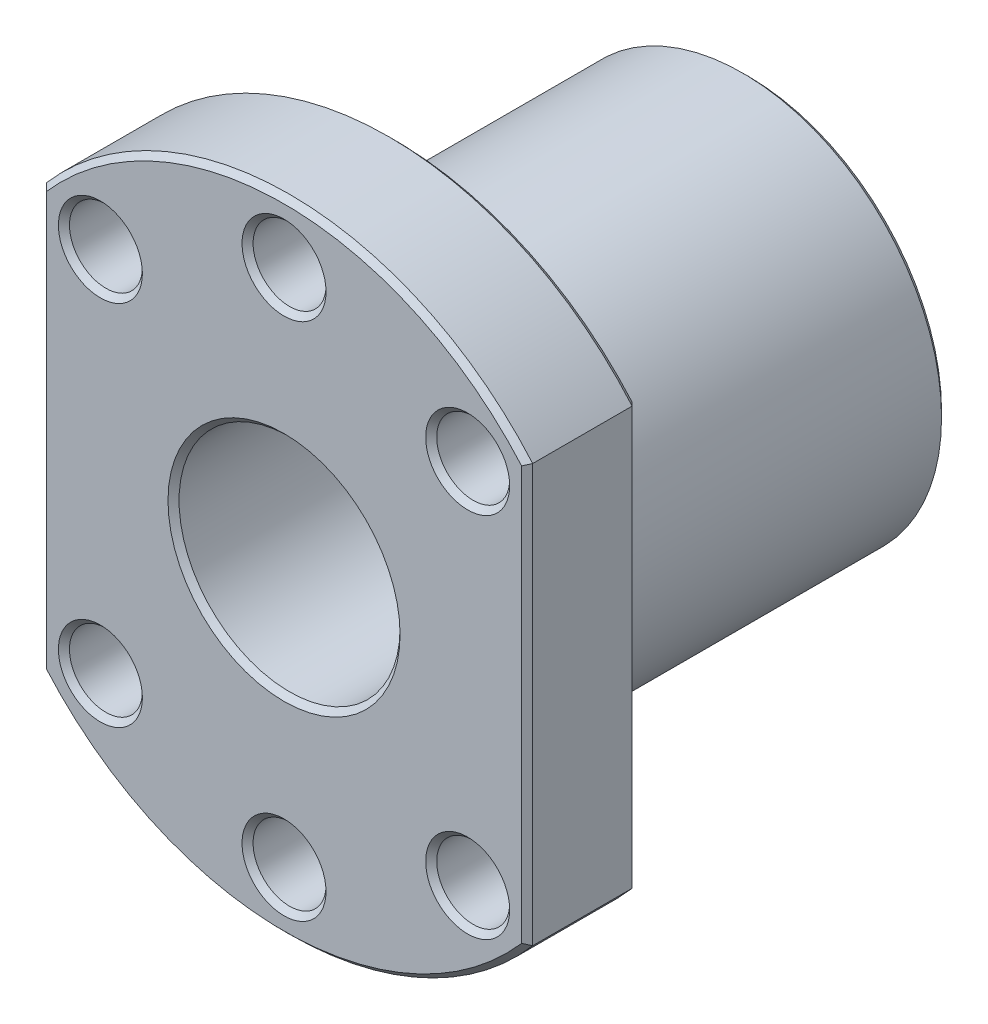
ISO-10303-21;
HEADER;
FILE_DESCRIPTION(('STEP AP214'),'2;1');
FILE_NAME('part.step','',(''),(''),'','','');
FILE_SCHEMA(('AUTOMOTIVE_DESIGN { 1 0 10303 214 1 1 1 1 }'));
ENDSEC;
DATA;
#1=APPLICATION_CONTEXT('core data for automotive mechanical design processes');
#2=APPLICATION_PROTOCOL_DEFINITION('international standard','automotive_design',2000,#1);
#3=PRODUCT_CONTEXT('',#1,'mechanical');
#4=PRODUCT('Part','Part','',(#3));
#5=PRODUCT_RELATED_PRODUCT_CATEGORY('part','',(#4));
#6=PRODUCT_DEFINITION_FORMATION('','',#4);
#7=PRODUCT_DEFINITION_CONTEXT('part definition',#1,'design');
#8=PRODUCT_DEFINITION('design','',#6,#7);
#9=PRODUCT_DEFINITION_SHAPE('','',#8);
#10=(LENGTH_UNIT() NAMED_UNIT(*) SI_UNIT(.MILLI.,.METRE.));
#11=(NAMED_UNIT(*) PLANE_ANGLE_UNIT() SI_UNIT($,.RADIAN.));
#12=(NAMED_UNIT(*) SI_UNIT($,.STERADIAN.) SOLID_ANGLE_UNIT());
#13=UNCERTAINTY_MEASURE_WITH_UNIT(LENGTH_MEASURE(1.E-05),#10,'distance_accuracy_value','');
#14=(GEOMETRIC_REPRESENTATION_CONTEXT(3) GLOBAL_UNCERTAINTY_ASSIGNED_CONTEXT((#13)) GLOBAL_UNIT_ASSIGNED_CONTEXT((#10,
#11,#12)) REPRESENTATION_CONTEXT('',''));
#15=CARTESIAN_POINT('',(0.,0.,0.));
#16=DIRECTION('',(0.,0.,1.));
#17=DIRECTION('',(1.,0.,0.));
#18=AXIS2_PLACEMENT_3D('',#15,#16,#17);
#19=CARTESIAN_POINT('',(0.,0.,0.));
#20=DIRECTION('',(0.,0.,1.00000000000001));
#21=DIRECTION('',(1.00000000000001,0.,0.));
#22=AXIS2_PLACEMENT_3D('',#19,#20,#21);
#23=PLANE('',#22);
#24=CARTESIAN_POINT('',(0.,0.,0.));
#25=DIRECTION('',(0.,0.,1.00000000000001));
#26=DIRECTION('',(1.00000000000001,0.,0.));
#27=AXIS2_PLACEMENT_3D('',#24,#25,#26);
#28=CIRCLE('',#27,18.5);
#29=CARTESIAN_POINT('',(18.5000000000002,0.,0.));
#30=VERTEX_POINT('',#29);
#31=EDGE_CURVE('E139',#30,#30,#28,.T.);
#32=ORIENTED_EDGE('',*,*,#31,.T.);
#33=EDGE_LOOP('',(#32));
#34=FACE_BOUND('',#33,.T.);
#35=CARTESIAN_POINT('',(0.,0.,0.));
#36=DIRECTION('',(0.,0.,1.00000000000001));
#37=DIRECTION('',(1.00000000000001,0.,0.));
#38=AXIS2_PLACEMENT_3D('',#35,#36,#37);
#39=CIRCLE('',#38,28.5);
#40=CARTESIAN_POINT('',(-21.5000000000002,18.7082869338698,0.));
#41=VERTEX_POINT('',#40);
#42=CARTESIAN_POINT('',(21.5,18.7082869338698,0.));
#43=VERTEX_POINT('',#42);
#44=EDGE_CURVE('E138',#41,#43,#39,.F.);
#45=ORIENTED_EDGE('',*,*,#44,.T.);
#46=DIRECTION('',(0.,-1.,0.));
#47=VECTOR('',#46,1.);
#48=CARTESIAN_POINT('',(21.5,0.,-4.40619762898109E-13));
#49=LINE('',#48,#47);
#50=CARTESIAN_POINT('',(21.5,-18.7082869338697,0.));
#51=VERTEX_POINT('',#50);
#52=EDGE_CURVE('E117',#43,#51,#49,.T.);
#53=ORIENTED_EDGE('',*,*,#52,.T.);
#54=CARTESIAN_POINT('',(0.,0.,0.));
#55=DIRECTION('',(0.,0.,1.00000000000001));
#56=DIRECTION('',(1.00000000000001,0.,0.));
#57=AXIS2_PLACEMENT_3D('',#54,#55,#56);
#58=CIRCLE('',#57,28.5);
#59=CARTESIAN_POINT('',(-21.5000000000004,-18.7082869338697,0.));
#60=VERTEX_POINT('',#59);
#61=EDGE_CURVE('E127',#51,#60,#58,.F.);
#62=ORIENTED_EDGE('',*,*,#61,.T.);
#63=DIRECTION('',(0.,1.,0.));
#64=VECTOR('',#63,1.);
#65=CARTESIAN_POINT('',(-21.5000000000002,0.,0.));
#66=LINE('',#65,#64);
#67=EDGE_CURVE('E133',#60,#41,#66,.T.);
#68=ORIENTED_EDGE('',*,*,#67,.T.);
#69=EDGE_LOOP('',(#45,#53,#62,#68));
#70=FACE_BOUND('',#69,.T.);
#71=CARTESIAN_POINT('',(0.,23.5000000000001,0.));
#72=DIRECTION('',(0.,0.,1.00000000000001));
#73=DIRECTION('',(1.00000000000001,0.,0.));
#74=AXIS2_PLACEMENT_3D('',#71,#72,#73);
#75=CIRCLE('',#74,3.8);
#76=CARTESIAN_POINT('',(3.80000000000003,23.5000000000001,0.));
#77=VERTEX_POINT('',#76);
#78=EDGE_CURVE('E134',#77,#77,#75,.T.);
#79=ORIENTED_EDGE('',*,*,#78,.T.);
#80=EDGE_LOOP('',(#79));
#81=FACE_BOUND('',#80,.T.);
#82=CARTESIAN_POINT('',(16.6170093578839,16.617009357884,0.));
#83=DIRECTION('',(0.,0.,1.00000000000001));
#84=DIRECTION('',(1.00000000000001,0.,0.));
#85=AXIS2_PLACEMENT_3D('',#82,#83,#84);
#86=CIRCLE('',#85,3.8);
#87=CARTESIAN_POINT('',(20.4170093578839,16.617009357884,0.));
#88=VERTEX_POINT('',#87);
#89=EDGE_CURVE('E351',#88,#88,#86,.T.);
#90=ORIENTED_EDGE('',*,*,#89,.T.);
#91=EDGE_LOOP('',(#90));
#92=FACE_BOUND('',#91,.T.);
#93=CARTESIAN_POINT('',(16.6170093578839,-16.6170093578839,0.));
#94=DIRECTION('',(0.,0.,1.00000000000001));
#95=DIRECTION('',(1.00000000000001,0.,0.));
#96=AXIS2_PLACEMENT_3D('',#93,#94,#95);
#97=CIRCLE('',#96,3.8);
#98=CARTESIAN_POINT('',(20.4170093578839,-16.6170093578839,0.));
#99=VERTEX_POINT('',#98);
#100=EDGE_CURVE('E348',#99,#99,#97,.T.);
#101=ORIENTED_EDGE('',*,*,#100,.T.);
#102=EDGE_LOOP('',(#101));
#103=FACE_BOUND('',#102,.T.);
#104=CARTESIAN_POINT('',(-1.11022302462516E-13,-23.5,0.));
#105=DIRECTION('',(0.,0.,1.00000000000001));
#106=DIRECTION('',(1.00000000000001,0.,0.));
#107=AXIS2_PLACEMENT_3D('',#104,#105,#106);
#108=CIRCLE('',#107,3.8);
#109=CARTESIAN_POINT('',(3.79999999999992,-23.5,0.));
#110=VERTEX_POINT('',#109);
#111=EDGE_CURVE('E345',#110,#110,#108,.T.);
#112=ORIENTED_EDGE('',*,*,#111,.T.);
#113=EDGE_LOOP('',(#112));
#114=FACE_BOUND('',#113,.T.);
#115=CARTESIAN_POINT('',(-16.6170093578843,-16.6170093578839,0.));
#116=DIRECTION('',(0.,0.,1.00000000000001));
#117=DIRECTION('',(1.00000000000001,0.,0.));
#118=AXIS2_PLACEMENT_3D('',#115,#116,#117);
#119=CIRCLE('',#118,3.80000000000002);
#120=CARTESIAN_POINT('',(-12.8170093578842,-16.6170093578839,0.));
#121=VERTEX_POINT('',#120);
#122=EDGE_CURVE('E342',#121,#121,#119,.T.);
#123=ORIENTED_EDGE('',*,*,#122,.T.);
#124=EDGE_LOOP('',(#123));
#125=FACE_BOUND('',#124,.T.);
#126=CARTESIAN_POINT('',(-16.6170093578841,16.617009357884,0.));
#127=DIRECTION('',(0.,0.,1.00000000000001));
#128=DIRECTION('',(1.00000000000001,0.,0.));
#129=AXIS2_PLACEMENT_3D('',#126,#127,#128);
#130=CIRCLE('',#129,3.8);
#131=CARTESIAN_POINT('',(-12.8170093578841,16.617009357884,0.));
#132=VERTEX_POINT('',#131);
#133=EDGE_CURVE('E339',#132,#132,#130,.T.);
#134=ORIENTED_EDGE('',*,*,#133,.T.);
#135=EDGE_LOOP('',(#134));
#136=FACE_BOUND('',#135,.T.);
#137=ADVANCED_FACE('F40',(#34,#70,#81,#92,#103,#114,#125,#136),#23,.F.);
#138=CARTESIAN_POINT('',(0.,0.,10.));
#139=DIRECTION('',(0.,0.,1.00000000000001));
#140=DIRECTION('',(1.00000000000001,0.,0.));
#141=AXIS2_PLACEMENT_3D('',#138,#139,#140);
#142=PLANE('',#141);
#143=CARTESIAN_POINT('',(-16.617009357884,16.617009357884,10.));
#144=DIRECTION('',(0.,0.,1.00000000000001));
#145=DIRECTION('',(1.00000000000001,0.,0.));
#146=AXIS2_PLACEMENT_3D('',#143,#144,#145);
#147=CIRCLE('',#146,3.80000000000001);
#148=CARTESIAN_POINT('',(-12.8170093578839,16.617009357884,10.));
#149=VERTEX_POINT('',#148);
#150=EDGE_CURVE('E12',#149,#149,#147,.F.);
#151=ORIENTED_EDGE('',*,*,#150,.T.);
#152=EDGE_LOOP('',(#151));
#153=FACE_BOUND('',#152,.T.);
#154=CARTESIAN_POINT('',(0.,-23.5,10.));
#155=DIRECTION('',(0.,0.,1.00000000000001));
#156=DIRECTION('',(1.00000000000001,0.,0.));
#157=AXIS2_PLACEMENT_3D('',#154,#155,#156);
#158=CIRCLE('',#157,3.80000000000001);
#159=CARTESIAN_POINT('',(3.80000000000005,-23.5,10.));
#160=VERTEX_POINT('',#159);
#161=EDGE_CURVE('E54',#160,#160,#158,.F.);
#162=ORIENTED_EDGE('',*,*,#161,.T.);
#163=EDGE_LOOP('',(#162));
#164=FACE_BOUND('',#163,.T.);
#165=CARTESIAN_POINT('',(16.617009357884,16.617009357884,10.));
#166=DIRECTION('',(0.,0.,1.00000000000001));
#167=DIRECTION('',(1.00000000000001,0.,0.));
#168=AXIS2_PLACEMENT_3D('',#165,#166,#167);
#169=CIRCLE('',#168,3.80000000000001);
#170=CARTESIAN_POINT('',(20.417009357884,16.617009357884,10.));
#171=VERTEX_POINT('',#170);
#172=EDGE_CURVE('E216',#171,#171,#169,.F.);
#173=ORIENTED_EDGE('',*,*,#172,.T.);
#174=EDGE_LOOP('',(#173));
#175=FACE_BOUND('',#174,.T.);
#176=CARTESIAN_POINT('',(0.,0.,10.));
#177=DIRECTION('',(0.,0.,1.00000000000001));
#178=DIRECTION('',(1.00000000000001,0.,0.));
#179=AXIS2_PLACEMENT_3D('',#176,#177,#178);
#180=CIRCLE('',#179,10.5);
#181=CARTESIAN_POINT('',(10.5000000000001,0.,10.));
#182=VERTEX_POINT('',#181);
#183=EDGE_CURVE('E213',#182,#182,#180,.F.);
#184=ORIENTED_EDGE('',*,*,#183,.T.);
#185=EDGE_LOOP('',(#184));
#186=FACE_BOUND('',#185,.T.);
#187=CARTESIAN_POINT('',(0.,0.,10.));
#188=DIRECTION('',(0.,0.,1.00000000000001));
#189=DIRECTION('',(1.00000000000001,0.,0.));
#190=AXIS2_PLACEMENT_3D('',#187,#188,#189);
#191=CIRCLE('',#190,28.5);
#192=CARTESIAN_POINT('',(21.5000000000001,18.7082869338698,10.));
#193=VERTEX_POINT('',#192);
#194=CARTESIAN_POINT('',(-21.5000000000001,18.7082869338699,10.));
#195=VERTEX_POINT('',#194);
#196=EDGE_CURVE('E62',#193,#195,#191,.T.);
#197=ORIENTED_EDGE('',*,*,#196,.T.);
#198=DIRECTION('',(0.,-1.,0.));
#199=VECTOR('',#198,1.);
#200=CARTESIAN_POINT('',(-21.5000000000002,-18.8944436276912,10.));
#201=LINE('',#200,#199);
#202=CARTESIAN_POINT('',(-21.5000000000002,-18.7082869338697,10.));
#203=VERTEX_POINT('',#202);
#204=EDGE_CURVE('E211',#195,#203,#201,.T.);
#205=ORIENTED_EDGE('',*,*,#204,.T.);
#206=CARTESIAN_POINT('',(0.,0.,10.));
#207=DIRECTION('',(0.,0.,1.00000000000001));
#208=DIRECTION('',(1.00000000000001,0.,0.));
#209=AXIS2_PLACEMENT_3D('',#206,#207,#208);
#210=CIRCLE('',#209,28.5);
#211=CARTESIAN_POINT('',(21.5,-18.7082869338697,10.));
#212=VERTEX_POINT('',#211);
#213=EDGE_CURVE('E207',#203,#212,#210,.T.);
#214=ORIENTED_EDGE('',*,*,#213,.T.);
#215=DIRECTION('',(0.,1.,0.));
#216=VECTOR('',#215,1.);
#217=CARTESIAN_POINT('',(21.5000000000001,18.8944436276913,10.));
#218=LINE('',#217,#216);
#219=EDGE_CURVE('E67',#212,#193,#218,.T.);
#220=ORIENTED_EDGE('',*,*,#219,.T.);
#221=EDGE_LOOP('',(#197,#205,#214,#220));
#222=FACE_BOUND('',#221,.T.);
#223=CARTESIAN_POINT('',(1.11022302462516E-13,23.5000000000001,10.));
#224=DIRECTION('',(0.,0.,1.00000000000001));
#225=DIRECTION('',(1.00000000000001,0.,0.));
#226=AXIS2_PLACEMENT_3D('',#223,#224,#225);
#227=CIRCLE('',#226,3.80000000000001);
#228=CARTESIAN_POINT('',(3.80000000000016,23.5000000000001,10.));
#229=VERTEX_POINT('',#228);
#230=EDGE_CURVE('E204',#229,#229,#227,.F.);
#231=ORIENTED_EDGE('',*,*,#230,.T.);
#232=EDGE_LOOP('',(#231));
#233=FACE_BOUND('',#232,.T.);
#234=CARTESIAN_POINT('',(16.6170093578839,-16.6170093578839,10.));
#235=DIRECTION('',(0.,0.,1.00000000000001));
#236=DIRECTION('',(1.00000000000001,0.,0.));
#237=AXIS2_PLACEMENT_3D('',#234,#235,#236);
#238=CIRCLE('',#237,3.80000000000001);
#239=CARTESIAN_POINT('',(20.4170093578839,-16.6170093578839,10.));
#240=VERTEX_POINT('',#239);
#241=EDGE_CURVE('E201',#240,#240,#238,.F.);
#242=ORIENTED_EDGE('',*,*,#241,.T.);
#243=EDGE_LOOP('',(#242));
#244=FACE_BOUND('',#243,.T.);
#245=CARTESIAN_POINT('',(-16.6170093578841,-16.6170093578839,10.));
#246=DIRECTION('',(0.,0.,1.00000000000001));
#247=DIRECTION('',(1.00000000000001,0.,0.));
#248=AXIS2_PLACEMENT_3D('',#245,#246,#247);
#249=CIRCLE('',#248,3.80000000000001);
#250=CARTESIAN_POINT('',(-12.8170093578841,-16.6170093578839,10.));
#251=VERTEX_POINT('',#250);
#252=EDGE_CURVE('E198',#251,#251,#249,.F.);
#253=ORIENTED_EDGE('',*,*,#252,.T.);
#254=EDGE_LOOP('',(#253));
#255=FACE_BOUND('',#254,.T.);
#256=ADVANCED_FACE('F365',(#153,#164,#175,#186,#222,#233,#244,#255),#142,.T.);
#257=CARTESIAN_POINT('',(0.,0.,10.));
#258=DIRECTION('',(0.,0.,-1.00000000000001));
#259=DIRECTION('',(-1.00000000000001,0.,0.));
#260=AXIS2_PLACEMENT_3D('',#257,#258,#259);
#261=CYLINDRICAL_SURFACE('',#260,29.);
#262=DIRECTION('',(0.,0.,-1.00000000000001));
#263=VECTOR('',#262,1.);
#264=CARTESIAN_POINT('',(-22.0000000000002,-18.8944436276912,10.));
#265=LINE('',#264,#263);
#266=CARTESIAN_POINT('',(-22.0000000000002,-18.8944436276912,9.50000000000007));
#267=VERTEX_POINT('',#266);
#268=CARTESIAN_POINT('',(-22.0000000000004,-18.8944436276912,0.500000000000056));
#269=VERTEX_POINT('',#268);
#270=EDGE_CURVE('E250',#267,#269,#265,.T.);
#271=ORIENTED_EDGE('',*,*,#270,.T.);
#272=CARTESIAN_POINT('',(0.,0.,0.500000000000056));
#273=DIRECTION('',(0.,0.,1.00000000000001));
#274=DIRECTION('',(1.00000000000001,0.,0.));
#275=AXIS2_PLACEMENT_3D('',#272,#273,#274);
#276=CIRCLE('',#275,29.);
#277=CARTESIAN_POINT('',(21.9999999999998,-18.8944436276912,0.500000000000056));
#278=VERTEX_POINT('',#277);
#279=EDGE_CURVE('E160',#269,#278,#276,.T.);
#280=ORIENTED_EDGE('',*,*,#279,.T.);
#281=DIRECTION('',(0.,0.,-1.00000000000001));
#282=VECTOR('',#281,1.);
#283=CARTESIAN_POINT('',(22.,-18.8944436276912,10.));
#284=LINE('',#283,#282);
#285=CARTESIAN_POINT('',(22.,-18.8944436276912,9.50000000000007));
#286=VERTEX_POINT('',#285);
#287=EDGE_CURVE('E315',#286,#278,#284,.T.);
#288=ORIENTED_EDGE('',*,*,#287,.F.);
#289=CARTESIAN_POINT('',(0.,0.,9.50000000000007));
#290=DIRECTION('',(0.,0.,1.00000000000001));
#291=DIRECTION('',(1.00000000000001,0.,0.));
#292=AXIS2_PLACEMENT_3D('',#289,#290,#291);
#293=CIRCLE('',#292,29.);
#294=EDGE_CURVE('E158',#286,#267,#293,.F.);
#295=ORIENTED_EDGE('',*,*,#294,.T.);
#296=EDGE_LOOP('',(#271,#280,#288,#295));
#297=FACE_BOUND('',#296,.T.);
#298=ADVANCED_FACE('F364',(#297),#261,.T.);
#299=CARTESIAN_POINT('',(22.0000000000001,18.8944436276913,10.));
#300=DIRECTION('',(-1.00000000000001,0.,0.));
#301=DIRECTION('',(0.,0.,1.00000000000001));
#302=AXIS2_PLACEMENT_3D('',#299,#300,#301);
#303=PLANE('',#302);
#304=ORIENTED_EDGE('',*,*,#287,.T.);
#305=DIRECTION('',(0.,1.,0.));
#306=VECTOR('',#305,1.);
#307=CARTESIAN_POINT('',(22.,18.8944436276913,0.499999999999945));
#308=LINE('',#307,#306);
#309=CARTESIAN_POINT('',(22.,18.8944436276913,0.499999999999945));
#310=VERTEX_POINT('',#309);
#311=EDGE_CURVE('E120',#278,#310,#308,.T.);
#312=ORIENTED_EDGE('',*,*,#311,.T.);
#313=DIRECTION('',(0.,0.,-1.00000000000001));
#314=VECTOR('',#313,1.);
#315=CARTESIAN_POINT('',(22.0000000000001,18.8944436276913,10.));
#316=LINE('',#315,#314);
#317=CARTESIAN_POINT('',(22.0000000000001,18.8944436276913,9.49999999999996));
#318=VERTEX_POINT('',#317);
#319=EDGE_CURVE('E313',#318,#310,#316,.T.);
#320=ORIENTED_EDGE('',*,*,#319,.F.);
#321=DIRECTION('',(0.,-1.,0.));
#322=VECTOR('',#321,1.);
#323=CARTESIAN_POINT('',(22.,-18.8944436276912,9.50000000000007));
#324=LINE('',#323,#322);
#325=EDGE_CURVE('E142',#318,#286,#324,.T.);
#326=ORIENTED_EDGE('',*,*,#325,.T.);
#327=EDGE_LOOP('',(#304,#312,#320,#326));
#328=FACE_BOUND('',#327,.T.);
#329=ADVANCED_FACE('F360',(#328),#303,.F.);
#330=CARTESIAN_POINT('',(0.,0.,10.));
#331=DIRECTION('',(0.,0.,-1.00000000000001));
#332=DIRECTION('',(-1.00000000000001,0.,0.));
#333=AXIS2_PLACEMENT_3D('',#330,#331,#332);
#334=CYLINDRICAL_SURFACE('',#333,29.);
#335=ORIENTED_EDGE('',*,*,#319,.T.);
#336=CARTESIAN_POINT('',(0.,0.,0.500000000000056));
#337=DIRECTION('',(0.,0.,1.00000000000001));
#338=DIRECTION('',(1.00000000000001,0.,0.));
#339=AXIS2_PLACEMENT_3D('',#336,#337,#338);
#340=CIRCLE('',#339,29.);
#341=CARTESIAN_POINT('',(-22.0000000000003,18.8944436276914,0.499999999999948));
#342=VERTEX_POINT('',#341);
#343=EDGE_CURVE('E151',#310,#342,#340,.T.);
#344=ORIENTED_EDGE('',*,*,#343,.T.);
#345=DIRECTION('',(0.,0.,-1.00000000000001));
#346=VECTOR('',#345,1.);
#347=CARTESIAN_POINT('',(-22.0000000000001,18.8944436276913,10.));
#348=LINE('',#347,#346);
#349=CARTESIAN_POINT('',(-22.0000000000001,18.8944436276913,9.49999999999996));
#350=VERTEX_POINT('',#349);
#351=EDGE_CURVE('E308',#350,#342,#348,.T.);
#352=ORIENTED_EDGE('',*,*,#351,.F.);
#353=CARTESIAN_POINT('',(0.,0.,9.50000000000007));
#354=DIRECTION('',(0.,0.,1.00000000000001));
#355=DIRECTION('',(1.00000000000001,0.,0.));
#356=AXIS2_PLACEMENT_3D('',#353,#354,#355);
#357=CIRCLE('',#356,29.);
#358=EDGE_CURVE('E149',#350,#318,#357,.F.);
#359=ORIENTED_EDGE('',*,*,#358,.T.);
#360=EDGE_LOOP('',(#335,#344,#352,#359));
#361=FACE_BOUND('',#360,.T.);
#362=ADVANCED_FACE('F311',(#361),#334,.T.);
#363=CARTESIAN_POINT('',(-22.0000000000001,18.8944436276913,10.));
#364=DIRECTION('',(1.00000000000001,0.,0.));
#365=DIRECTION('',(0.,0.,-1.00000000000001));
#366=AXIS2_PLACEMENT_3D('',#363,#364,#365);
#367=PLANE('',#366);
#368=ORIENTED_EDGE('',*,*,#351,.T.);
#369=DIRECTION('',(0.,-1.,0.));
#370=VECTOR('',#369,1.);
#371=CARTESIAN_POINT('',(-22.0000000000003,18.8944436276914,0.499999999999948));
#372=LINE('',#371,#370);
#373=EDGE_CURVE('E156',#342,#269,#372,.T.);
#374=ORIENTED_EDGE('',*,*,#373,.T.);
#375=ORIENTED_EDGE('',*,*,#270,.F.);
#376=DIRECTION('',(0.,1.,0.));
#377=VECTOR('',#376,1.);
#378=CARTESIAN_POINT('',(-22.0000000000001,18.8944436276913,9.49999999999996));
#379=LINE('',#378,#377);
#380=EDGE_CURVE('E153',#267,#350,#379,.T.);
#381=ORIENTED_EDGE('',*,*,#380,.T.);
#382=EDGE_LOOP('',(#368,#374,#375,#381));
#383=FACE_BOUND('',#382,.T.);
#384=ADVANCED_FACE('F307',(#383),#367,.F.);
#385=CARTESIAN_POINT('',(0.,0.,10.));
#386=DIRECTION('',(0.,0.,-1.00000000000001));
#387=DIRECTION('',(-1.00000000000001,0.,0.));
#388=AXIS2_PLACEMENT_3D('',#385,#386,#387);
#389=CYLINDRICAL_SURFACE('',#388,10.);
#390=CARTESIAN_POINT('',(2.22044604925031E-13,0.,-31.5));
#391=DIRECTION('',(0.,0.,1.00000000000001));
#392=DIRECTION('',(1.00000000000001,0.,0.));
#393=AXIS2_PLACEMENT_3D('',#390,#391,#392);
#394=CIRCLE('',#393,10.);
#395=CARTESIAN_POINT('',(10.0000000000003,0.,-31.5));
#396=VERTEX_POINT('',#395);
#397=EDGE_CURVE('E336',#396,#396,#394,.F.);
#398=ORIENTED_EDGE('',*,*,#397,.T.);
#399=EDGE_LOOP('',(#398));
#400=FACE_BOUND('',#399,.T.);
#401=CARTESIAN_POINT('',(0.,0.,9.50000000000007));
#402=DIRECTION('',(0.,0.,1.00000000000001));
#403=DIRECTION('',(1.00000000000001,0.,0.));
#404=AXIS2_PLACEMENT_3D('',#401,#402,#403);
#405=CIRCLE('',#404,10.);
#406=CARTESIAN_POINT('',(10.0000000000001,0.,9.50000000000007));
#407=VERTEX_POINT('',#406);
#408=EDGE_CURVE('E333',#407,#407,#405,.T.);
#409=ORIENTED_EDGE('',*,*,#408,.T.);
#410=EDGE_LOOP('',(#409));
#411=FACE_BOUND('',#410,.T.);
#412=ADVANCED_FACE('F406',(#400,#411),#389,.F.);
#413=CARTESIAN_POINT('',(1.11022302462516E-13,23.5000000000001,10.));
#414=DIRECTION('',(0.,0.,-1.00000000000001));
#415=DIRECTION('',(-1.00000000000001,0.,0.));
#416=AXIS2_PLACEMENT_3D('',#413,#414,#415);
#417=CYLINDRICAL_SURFACE('',#416,3.3);
#418=CARTESIAN_POINT('',(0.,23.5000000000001,0.500000000000056));
#419=DIRECTION('',(0.,0.,1.00000000000001));
#420=DIRECTION('',(1.00000000000001,0.,0.));
#421=AXIS2_PLACEMENT_3D('',#418,#419,#420);
#422=CIRCLE('',#421,3.3);
#423=CARTESIAN_POINT('',(3.30000000000003,23.5000000000001,0.500000000000055));
#424=VERTEX_POINT('',#423);
#425=EDGE_CURVE('E165',#424,#424,#422,.F.);
#426=ORIENTED_EDGE('',*,*,#425,.T.);
#427=EDGE_LOOP('',(#426));
#428=FACE_BOUND('',#427,.T.);
#429=CARTESIAN_POINT('',(1.11022302462516E-13,23.5000000000001,9.50000000000007));
#430=DIRECTION('',(0.,0.,1.00000000000001));
#431=DIRECTION('',(1.00000000000001,0.,0.));
#432=AXIS2_PLACEMENT_3D('',#429,#430,#431);
#433=CIRCLE('',#432,3.3);
#434=CARTESIAN_POINT('',(3.30000000000014,23.5000000000001,9.50000000000007));
#435=VERTEX_POINT('',#434);
#436=EDGE_CURVE('E162',#435,#435,#433,.T.);
#437=ORIENTED_EDGE('',*,*,#436,.T.);
#438=EDGE_LOOP('',(#437));
#439=FACE_BOUND('',#438,.T.);
#440=ADVANCED_FACE('F595',(#428,#439),#417,.F.);
#441=CARTESIAN_POINT('',(16.617009357884,16.617009357884,10.));
#442=DIRECTION('',(0.,0.,-1.00000000000001));
#443=DIRECTION('',(-1.00000000000001,0.,0.));
#444=AXIS2_PLACEMENT_3D('',#441,#442,#443);
#445=CYLINDRICAL_SURFACE('',#444,3.3);
#446=CARTESIAN_POINT('',(16.6170093578839,16.617009357884,0.500000000000056));
#447=DIRECTION('',(0.,0.,1.00000000000001));
#448=DIRECTION('',(1.00000000000001,0.,0.));
#449=AXIS2_PLACEMENT_3D('',#446,#447,#448);
#450=CIRCLE('',#449,3.3);
#451=CARTESIAN_POINT('',(19.9170093578839,16.617009357884,0.500000000000055));
#452=VERTEX_POINT('',#451);
#453=EDGE_CURVE('E171',#452,#452,#450,.F.);
#454=ORIENTED_EDGE('',*,*,#453,.T.);
#455=EDGE_LOOP('',(#454));
#456=FACE_BOUND('',#455,.T.);
#457=CARTESIAN_POINT('',(16.617009357884,16.617009357884,9.50000000000007));
#458=DIRECTION('',(0.,0.,1.00000000000001));
#459=DIRECTION('',(1.00000000000001,0.,0.));
#460=AXIS2_PLACEMENT_3D('',#457,#458,#459);
#461=CIRCLE('',#460,3.3);
#462=CARTESIAN_POINT('',(19.917009357884,16.617009357884,9.50000000000007));
#463=VERTEX_POINT('',#462);
#464=EDGE_CURVE('E168',#463,#463,#461,.T.);
#465=ORIENTED_EDGE('',*,*,#464,.T.);
#466=EDGE_LOOP('',(#465));
#467=FACE_BOUND('',#466,.T.);
#468=ADVANCED_FACE('F589',(#456,#467),#445,.F.);
#469=CARTESIAN_POINT('',(16.6170093578839,-16.6170093578839,10.));
#470=DIRECTION('',(0.,0.,-1.00000000000001));
#471=DIRECTION('',(-1.00000000000001,0.,0.));
#472=AXIS2_PLACEMENT_3D('',#469,#470,#471);
#473=CYLINDRICAL_SURFACE('',#472,3.3);
#474=CARTESIAN_POINT('',(16.6170093578837,-16.6170093578839,0.499999999999948));
#475=DIRECTION('',(0.,0.,1.00000000000001));
#476=DIRECTION('',(1.00000000000001,0.,0.));
#477=AXIS2_PLACEMENT_3D('',#474,#475,#476);
#478=CIRCLE('',#477,3.3);
#479=CARTESIAN_POINT('',(19.9170093578837,-16.6170093578839,0.499999999999948));
#480=VERTEX_POINT('',#479);
#481=EDGE_CURVE('E177',#480,#480,#478,.F.);
#482=ORIENTED_EDGE('',*,*,#481,.T.);
#483=EDGE_LOOP('',(#482));
#484=FACE_BOUND('',#483,.T.);
#485=CARTESIAN_POINT('',(16.6170093578839,-16.6170093578839,9.49999999999996));
#486=DIRECTION('',(0.,0.,1.00000000000001));
#487=DIRECTION('',(1.00000000000001,0.,0.));
#488=AXIS2_PLACEMENT_3D('',#485,#486,#487);
#489=CIRCLE('',#488,3.3);
#490=CARTESIAN_POINT('',(19.9170093578839,-16.6170093578839,9.49999999999996));
#491=VERTEX_POINT('',#490);
#492=EDGE_CURVE('E174',#491,#491,#489,.T.);
#493=ORIENTED_EDGE('',*,*,#492,.T.);
#494=EDGE_LOOP('',(#493));
#495=FACE_BOUND('',#494,.T.);
#496=ADVANCED_FACE('F394',(#484,#495),#473,.F.);
#497=CARTESIAN_POINT('',(0.,-23.5,10.));
#498=DIRECTION('',(0.,0.,-1.00000000000001));
#499=DIRECTION('',(-1.00000000000001,0.,0.));
#500=AXIS2_PLACEMENT_3D('',#497,#498,#499);
#501=CYLINDRICAL_SURFACE('',#500,3.3);
#502=CARTESIAN_POINT('',(-1.11022302462516E-13,-23.5,0.499999999999945));
#503=DIRECTION('',(0.,0.,1.00000000000001));
#504=DIRECTION('',(1.00000000000001,0.,0.));
#505=AXIS2_PLACEMENT_3D('',#502,#503,#504);
#506=CIRCLE('',#505,3.3);
#507=CARTESIAN_POINT('',(3.29999999999992,-23.5,0.499999999999944));
#508=VERTEX_POINT('',#507);
#509=EDGE_CURVE('E183',#508,#508,#506,.F.);
#510=ORIENTED_EDGE('',*,*,#509,.T.);
#511=EDGE_LOOP('',(#510));
#512=FACE_BOUND('',#511,.T.);
#513=CARTESIAN_POINT('',(0.,-23.5,9.49999999999996));
#514=DIRECTION('',(0.,0.,1.00000000000001));
#515=DIRECTION('',(1.00000000000001,0.,0.));
#516=AXIS2_PLACEMENT_3D('',#513,#514,#515);
#517=CIRCLE('',#516,3.3);
#518=CARTESIAN_POINT('',(3.30000000000003,-23.5,9.49999999999996));
#519=VERTEX_POINT('',#518);
#520=EDGE_CURVE('E180',#519,#519,#517,.T.);
#521=ORIENTED_EDGE('',*,*,#520,.T.);
#522=EDGE_LOOP('',(#521));
#523=FACE_BOUND('',#522,.T.);
#524=ADVANCED_FACE('F384',(#512,#523),#501,.F.);
#525=CARTESIAN_POINT('',(-16.6170093578841,-16.6170093578839,10.));
#526=DIRECTION('',(0.,0.,-1.00000000000001));
#527=DIRECTION('',(-1.00000000000001,0.,0.));
#528=AXIS2_PLACEMENT_3D('',#525,#526,#527);
#529=CYLINDRICAL_SURFACE('',#528,3.3);
#530=CARTESIAN_POINT('',(-16.6170093578843,-16.6170093578839,0.499999999999945));
#531=DIRECTION('',(0.,0.,1.00000000000001));
#532=DIRECTION('',(1.00000000000001,0.,0.));
#533=AXIS2_PLACEMENT_3D('',#530,#531,#532);
#534=CIRCLE('',#533,3.3);
#535=CARTESIAN_POINT('',(-13.3170093578843,-16.6170093578839,0.499999999999944));
#536=VERTEX_POINT('',#535);
#537=EDGE_CURVE('E189',#536,#536,#534,.F.);
#538=ORIENTED_EDGE('',*,*,#537,.T.);
#539=EDGE_LOOP('',(#538));
#540=FACE_BOUND('',#539,.T.);
#541=CARTESIAN_POINT('',(-16.6170093578841,-16.6170093578839,9.49999999999996));
#542=DIRECTION('',(0.,0.,1.00000000000001));
#543=DIRECTION('',(1.00000000000001,0.,0.));
#544=AXIS2_PLACEMENT_3D('',#541,#542,#543);
#545=CIRCLE('',#544,3.3);
#546=CARTESIAN_POINT('',(-13.3170093578841,-16.6170093578839,9.49999999999996));
#547=VERTEX_POINT('',#546);
#548=EDGE_CURVE('E186',#547,#547,#545,.T.);
#549=ORIENTED_EDGE('',*,*,#548,.T.);
#550=EDGE_LOOP('',(#549));
#551=FACE_BOUND('',#550,.T.);
#552=ADVANCED_FACE('F381',(#540,#551),#529,.F.);
#553=CARTESIAN_POINT('',(-16.617009357884,16.617009357884,10.));
#554=DIRECTION('',(0.,0.,-1.00000000000001));
#555=DIRECTION('',(-1.00000000000001,0.,0.));
#556=AXIS2_PLACEMENT_3D('',#553,#554,#555);
#557=CYLINDRICAL_SURFACE('',#556,3.3);
#558=CARTESIAN_POINT('',(-16.6170093578842,16.617009357884,0.500000000000056));
#559=DIRECTION('',(0.,0.,1.00000000000001));
#560=DIRECTION('',(1.00000000000001,0.,0.));
#561=AXIS2_PLACEMENT_3D('',#558,#559,#560);
#562=CIRCLE('',#561,3.3);
#563=CARTESIAN_POINT('',(-13.3170093578842,16.617009357884,0.500000000000055));
#564=VERTEX_POINT('',#563);
#565=EDGE_CURVE('E195',#564,#564,#562,.F.);
#566=ORIENTED_EDGE('',*,*,#565,.T.);
#567=EDGE_LOOP('',(#566));
#568=FACE_BOUND('',#567,.T.);
#569=CARTESIAN_POINT('',(-16.617009357884,16.617009357884,9.50000000000007));
#570=DIRECTION('',(0.,0.,1.00000000000001));
#571=DIRECTION('',(1.00000000000001,0.,0.));
#572=AXIS2_PLACEMENT_3D('',#569,#570,#571);
#573=CIRCLE('',#572,3.3);
#574=CARTESIAN_POINT('',(-13.317009357884,16.617009357884,9.50000000000007));
#575=VERTEX_POINT('',#574);
#576=EDGE_CURVE('E192',#575,#575,#573,.T.);
#577=ORIENTED_EDGE('',*,*,#576,.T.);
#578=EDGE_LOOP('',(#577));
#579=FACE_BOUND('',#578,.T.);
#580=ADVANCED_FACE('F383',(#568,#579),#557,.F.);
#581=CARTESIAN_POINT('',(0.,0.,-124.911688245432));
#582=DIRECTION('',(0.,0.,1.00000000000001));
#583=DIRECTION('',(1.00000000000001,0.,0.));
#584=AXIS2_PLACEMENT_3D('',#581,#582,#583);
#585=CYLINDRICAL_SURFACE('',#584,18.);
#586=CARTESIAN_POINT('',(2.22044604925031E-13,0.,-31.5));
#587=DIRECTION('',(0.,0.,1.00000000000001));
#588=DIRECTION('',(1.00000000000001,0.,0.));
#589=AXIS2_PLACEMENT_3D('',#586,#587,#588);
#590=CIRCLE('',#589,18.);
#591=CARTESIAN_POINT('',(18.0000000000004,0.,-31.5));
#592=VERTEX_POINT('',#591);
#593=EDGE_CURVE('E324',#592,#592,#590,.T.);
#594=ORIENTED_EDGE('',*,*,#593,.T.);
#595=EDGE_LOOP('',(#594));
#596=FACE_BOUND('',#595,.T.);
#597=CARTESIAN_POINT('',(0.,0.,-0.500000000000056));
#598=DIRECTION('',(0.,0.,1.00000000000001));
#599=DIRECTION('',(1.00000000000001,0.,0.));
#600=AXIS2_PLACEMENT_3D('',#597,#598,#599);
#601=CIRCLE('',#600,18.);
#602=CARTESIAN_POINT('',(18.0000000000002,0.,-0.500000000000061));
#603=VERTEX_POINT('',#602);
#604=EDGE_CURVE('E321',#603,#603,#601,.F.);
#605=ORIENTED_EDGE('',*,*,#604,.T.);
#606=EDGE_LOOP('',(#605));
#607=FACE_BOUND('',#606,.T.);
#608=ADVANCED_FACE('F391',(#596,#607),#585,.T.);
#609=CARTESIAN_POINT('',(1.11022302462516E-13,0.,-32.));
#610=DIRECTION('',(0.,0.,1.00000000000001));
#611=DIRECTION('',(1.00000000000001,0.,0.));
#612=AXIS2_PLACEMENT_3D('',#609,#610,#611);
#613=PLANE('',#612);
#614=CARTESIAN_POINT('',(1.11022302462516E-13,0.,-32.));
#615=DIRECTION('',(0.,0.,1.00000000000001));
#616=DIRECTION('',(1.00000000000001,0.,0.));
#617=AXIS2_PLACEMENT_3D('',#614,#615,#616);
#618=CIRCLE('',#617,17.5);
#619=CARTESIAN_POINT('',(17.5000000000003,0.,-32.));
#620=VERTEX_POINT('',#619);
#621=EDGE_CURVE('E330',#620,#620,#618,.F.);
#622=ORIENTED_EDGE('',*,*,#621,.T.);
#623=EDGE_LOOP('',(#622));
#624=FACE_BOUND('',#623,.T.);
#625=CARTESIAN_POINT('',(1.11022302462516E-13,0.,-32.));
#626=DIRECTION('',(0.,0.,1.00000000000001));
#627=DIRECTION('',(1.00000000000001,0.,0.));
#628=AXIS2_PLACEMENT_3D('',#625,#626,#627);
#629=CIRCLE('',#628,10.5);
#630=CARTESIAN_POINT('',(10.5000000000002,0.,-32.));
#631=VERTEX_POINT('',#630);
#632=EDGE_CURVE('E327',#631,#631,#629,.T.);
#633=ORIENTED_EDGE('',*,*,#632,.T.);
#634=EDGE_LOOP('',(#633));
#635=FACE_BOUND('',#634,.T.);
#636=ADVANCED_FACE('F417',(#624,#635),#613,.F.);
#637=CARTESIAN_POINT('',(2.22044604925031E-13,0.,-31.5));
#638=DIRECTION('',(0.,0.,1.00000000000001));
#639=DIRECTION('',(1.00000000000001,0.,0.));
#640=AXIS2_PLACEMENT_3D('',#637,#638,#639);
#641=CONICAL_SURFACE('',#640,18.,0.785398163397441);
#642=ORIENTED_EDGE('',*,*,#621,.F.);
#643=EDGE_LOOP('',(#642));
#644=FACE_BOUND('',#643,.T.);
#645=ORIENTED_EDGE('',*,*,#593,.F.);
#646=EDGE_LOOP('',(#645));
#647=FACE_BOUND('',#646,.T.);
#648=ADVANCED_FACE('F413',(#644,#647),#641,.T.);
#649=CARTESIAN_POINT('',(1.11022302462516E-13,0.,-32.));
#650=DIRECTION('',(0.,0.,-1.00000000000001));
#651=DIRECTION('',(-1.00000000000001,0.,0.));
#652=AXIS2_PLACEMENT_3D('',#649,#650,#651);
#653=CONICAL_SURFACE('',#652,10.5,0.78539816339745);
#654=ORIENTED_EDGE('',*,*,#397,.F.);
#655=EDGE_LOOP('',(#654));
#656=FACE_BOUND('',#655,.T.);
#657=ORIENTED_EDGE('',*,*,#632,.F.);
#658=EDGE_LOOP('',(#657));
#659=FACE_BOUND('',#658,.T.);
#660=ADVANCED_FACE('F416',(#656,#659),#653,.F.);
#661=CARTESIAN_POINT('',(0.,0.,-0.500000000000056));
#662=DIRECTION('',(0.,0.,1.00000000000001));
#663=DIRECTION('',(1.00000000000001,0.,0.));
#664=AXIS2_PLACEMENT_3D('',#661,#662,#663);
#665=CONICAL_SURFACE('',#664,18.,0.785398163397441);
#666=ORIENTED_EDGE('',*,*,#31,.F.);
#667=EDGE_LOOP('',(#666));
#668=FACE_BOUND('',#667,.T.);
#669=ORIENTED_EDGE('',*,*,#604,.F.);
#670=EDGE_LOOP('',(#669));
#671=FACE_BOUND('',#670,.T.);
#672=ADVANCED_FACE('F420',(#668,#671),#665,.T.);
#673=CARTESIAN_POINT('',(-22.0000000000003,18.8944436276914,0.499999999999948));
#674=DIRECTION('',(0.707106781186547,0.,0.707106781186556));
#675=DIRECTION('',(0.,-1.,0.));
#676=AXIS2_PLACEMENT_3D('',#673,#674,#675);
#677=PLANE('',#676);
#678=CARTESIAN_POINT('',(-22.0000000000003,18.8944436276914,0.499999999999948));
#679=CARTESIAN_POINT('',(-21.9166399269159,18.8635611546942,0.416639926915473));
#680=CARTESIAN_POINT('',(-21.8332932238415,18.8326068604275,0.333293223841094));
#681=CARTESIAN_POINT('',(-21.6666265571746,18.7705546291546,0.166626557174273));
#682=CARTESIAN_POINT('',(-21.5833065935823,18.7394566921474,0.0833065935820033));
#683=CARTESIAN_POINT('',(-21.5000000000002,18.7082869338698,0.));
#684=B_SPLINE_CURVE_WITH_KNOTS('',3,(#678,#679,#680,#681,#682,#683),.UNSPECIFIED.,.F.,.F.,(4,2,
4),(0.,0.365600365758273,0.731200733878002),.UNSPECIFIED.);
#685=EDGE_CURVE('E123',#41,#342,#684,.F.);
#686=ORIENTED_EDGE('',*,*,#685,.F.);
#687=ORIENTED_EDGE('',*,*,#67,.F.);
#688=CARTESIAN_POINT('',(-22.0000000000004,-18.8944436276912,0.500000000000056));
#689=CARTESIAN_POINT('',(-21.9166399269159,-18.8635611546942,0.416639926915575));
#690=CARTESIAN_POINT('',(-21.8332932238415,-18.8326068604275,0.333293223841185));
#691=CARTESIAN_POINT('',(-21.6666265571747,-18.7705546291546,0.166626557174327));
#692=CARTESIAN_POINT('',(-21.5833065935824,-18.7394566921474,0.0833065935820315));
#693=CARTESIAN_POINT('',(-21.5000000000004,-18.7082869338697,0.));
#694=B_SPLINE_CURVE_WITH_KNOTS('',3,(#688,#689,#690,#691,#692,#693),.UNSPECIFIED.,.F.,.F.,(4,2,
4),(0.,0.365600365758277,0.731200733878007),.UNSPECIFIED.);
#695=EDGE_CURVE('E130',#269,#60,#694,.T.);
#696=ORIENTED_EDGE('',*,*,#695,.F.);
#697=ORIENTED_EDGE('',*,*,#373,.F.);
#698=EDGE_LOOP('',(#686,#687,#696,#697));
#699=FACE_BOUND('',#698,.T.);
#700=ADVANCED_FACE('F241',(#699),#677,.F.);
#701=CARTESIAN_POINT('',(0.,0.,0.500000000000056));
#702=DIRECTION('',(0.,0.,1.00000000000001));
#703=DIRECTION('',(1.00000000000001,0.,0.));
#704=AXIS2_PLACEMENT_3D('',#701,#702,#703);
#705=CONICAL_SURFACE('',#704,29.,0.785398163397455);
#706=ORIENTED_EDGE('',*,*,#695,.T.);
#707=ORIENTED_EDGE('',*,*,#61,.F.);
#708=CARTESIAN_POINT('',(21.5,-18.7082869338697,0.));
#709=CARTESIAN_POINT('',(21.583306593582,-18.7394566921476,0.0833065935819226));
#710=CARTESIAN_POINT('',(21.6666265571742,-18.7705546291549,0.166626557174163));
#711=CARTESIAN_POINT('',(21.833293223841,-18.8326068604278,0.333293223841021));
#712=CARTESIAN_POINT('',(21.9166399269154,-18.8635611546944,0.416639926915466));
#713=CARTESIAN_POINT('',(21.9999999999998,-18.8944436276912,0.500000000000056));
#714=B_SPLINE_CURVE_WITH_KNOTS('',3,(#708,#709,#710,#711,#712,#713),.UNSPECIFIED.,.F.,.F.,(4,2,
4),(0.,0.365600368119685,0.731200733877912),.UNSPECIFIED.);
#715=EDGE_CURVE('E113',#278,#51,#714,.F.);
#716=ORIENTED_EDGE('',*,*,#715,.F.);
#717=ORIENTED_EDGE('',*,*,#279,.F.);
#718=EDGE_LOOP('',(#706,#707,#716,#717));
#719=FACE_BOUND('',#718,.T.);
#720=ADVANCED_FACE('F128',(#719),#705,.T.);
#721=CARTESIAN_POINT('',(0.,0.,0.500000000000056));
#722=DIRECTION('',(0.,0.,1.00000000000001));
#723=DIRECTION('',(1.00000000000001,0.,0.));
#724=AXIS2_PLACEMENT_3D('',#721,#722,#723);
#725=CONICAL_SURFACE('',#724,29.,0.785398163397455);
#726=ORIENTED_EDGE('',*,*,#685,.T.);
#727=ORIENTED_EDGE('',*,*,#343,.F.);
#728=CARTESIAN_POINT('',(22.,18.8944436276913,0.499999999999945));
#729=CARTESIAN_POINT('',(21.9166399269155,18.8635611546944,0.416639926915436));
#730=CARTESIAN_POINT('',(21.8332932238411,18.8326068604278,0.333293223841041));
#731=CARTESIAN_POINT('',(21.6666265571743,18.770554629155,0.16662655717422));
#732=CARTESIAN_POINT('',(21.583306593582,18.7394566921477,0.0833065935819667));
#733=CARTESIAN_POINT('',(21.5,18.7082869338698,0.));
#734=B_SPLINE_CURVE_WITH_KNOTS('',3,(#728,#729,#730,#731,#732,#733),.UNSPECIFIED.,.F.,.F.,(4,2,
4),(0.,0.365600365758237,0.731200733877928),.UNSPECIFIED.);
#735=EDGE_CURVE('E124',#43,#310,#734,.F.);
#736=ORIENTED_EDGE('',*,*,#735,.F.);
#737=ORIENTED_EDGE('',*,*,#44,.F.);
#738=EDGE_LOOP('',(#726,#727,#736,#737));
#739=FACE_BOUND('',#738,.T.);
#740=ADVANCED_FACE('F231',(#739),#725,.T.);
#741=CARTESIAN_POINT('',(22.,18.8944436276913,0.499999999999945));
#742=DIRECTION('',(-0.707106781186547,0.,0.707106781186556));
#743=DIRECTION('',(0.,1.,0.));
#744=AXIS2_PLACEMENT_3D('',#741,#742,#743);
#745=PLANE('',#744);
#746=ORIENTED_EDGE('',*,*,#715,.T.);
#747=ORIENTED_EDGE('',*,*,#52,.F.);
#748=ORIENTED_EDGE('',*,*,#735,.T.);
#749=ORIENTED_EDGE('',*,*,#311,.F.);
#750=EDGE_LOOP('',(#746,#747,#748,#749));
#751=FACE_BOUND('',#750,.T.);
#752=ADVANCED_FACE('F115',(#751),#745,.F.);
#753=CARTESIAN_POINT('',(0.,23.5000000000001,0.));
#754=DIRECTION('',(0.,0.,-1.00000000000001));
#755=DIRECTION('',(-1.00000000000001,0.,0.));
#756=AXIS2_PLACEMENT_3D('',#753,#754,#755);
#757=CONICAL_SURFACE('',#756,3.8,0.785398163397453);
#758=ORIENTED_EDGE('',*,*,#425,.F.);
#759=EDGE_LOOP('',(#758));
#760=FACE_BOUND('',#759,.T.);
#761=ORIENTED_EDGE('',*,*,#78,.F.);
#762=EDGE_LOOP('',(#761));
#763=FACE_BOUND('',#762,.T.);
#764=ADVANCED_FACE('F236',(#760,#763),#757,.F.);
#765=CARTESIAN_POINT('',(16.6170093578839,16.617009357884,0.));
#766=DIRECTION('',(0.,0.,-1.00000000000001));
#767=DIRECTION('',(-1.00000000000001,0.,0.));
#768=AXIS2_PLACEMENT_3D('',#765,#766,#767);
#769=CONICAL_SURFACE('',#768,3.8,0.785398163397453);
#770=ORIENTED_EDGE('',*,*,#453,.F.);
#771=EDGE_LOOP('',(#770));
#772=FACE_BOUND('',#771,.T.);
#773=ORIENTED_EDGE('',*,*,#89,.F.);
#774=EDGE_LOOP('',(#773));
#775=FACE_BOUND('',#774,.T.);
#776=ADVANCED_FACE('F481',(#772,#775),#769,.F.);
#777=CARTESIAN_POINT('',(16.6170093578839,-16.6170093578839,0.));
#778=DIRECTION('',(0.,0.,-1.00000000000001));
#779=DIRECTION('',(-1.00000000000001,0.,0.));
#780=AXIS2_PLACEMENT_3D('',#777,#778,#779);
#781=CONICAL_SURFACE('',#780,3.8,0.785398163397453);
#782=ORIENTED_EDGE('',*,*,#481,.F.);
#783=EDGE_LOOP('',(#782));
#784=FACE_BOUND('',#783,.T.);
#785=ORIENTED_EDGE('',*,*,#100,.F.);
#786=EDGE_LOOP('',(#785));
#787=FACE_BOUND('',#786,.T.);
#788=ADVANCED_FACE('F488',(#784,#787),#781,.F.);
#789=CARTESIAN_POINT('',(-1.11022302462516E-13,-23.5,0.));
#790=DIRECTION('',(0.,0.,-1.00000000000001));
#791=DIRECTION('',(-1.00000000000001,0.,0.));
#792=AXIS2_PLACEMENT_3D('',#789,#790,#791);
#793=CONICAL_SURFACE('',#792,3.8,0.785398163397453);
#794=ORIENTED_EDGE('',*,*,#509,.F.);
#795=EDGE_LOOP('',(#794));
#796=FACE_BOUND('',#795,.T.);
#797=ORIENTED_EDGE('',*,*,#111,.F.);
#798=EDGE_LOOP('',(#797));
#799=FACE_BOUND('',#798,.T.);
#800=ADVANCED_FACE('F496',(#796,#799),#793,.F.);
#801=CARTESIAN_POINT('',(-16.6170093578843,-16.6170093578839,0.));
#802=DIRECTION('',(0.,0.,-1.00000000000001));
#803=DIRECTION('',(-1.00000000000001,0.,0.));
#804=AXIS2_PLACEMENT_3D('',#801,#802,#803);
#805=CONICAL_SURFACE('',#804,3.80000000000002,0.785398163397441);
#806=ORIENTED_EDGE('',*,*,#537,.F.);
#807=EDGE_LOOP('',(#806));
#808=FACE_BOUND('',#807,.T.);
#809=ORIENTED_EDGE('',*,*,#122,.F.);
#810=EDGE_LOOP('',(#809));
#811=FACE_BOUND('',#810,.T.);
#812=ADVANCED_FACE('F504',(#808,#811),#805,.F.);
#813=CARTESIAN_POINT('',(-16.6170093578841,16.617009357884,0.));
#814=DIRECTION('',(0.,0.,-1.00000000000001));
#815=DIRECTION('',(-1.00000000000001,0.,0.));
#816=AXIS2_PLACEMENT_3D('',#813,#814,#815);
#817=CONICAL_SURFACE('',#816,3.8,0.785398163397441);
#818=ORIENTED_EDGE('',*,*,#565,.F.);
#819=EDGE_LOOP('',(#818));
#820=FACE_BOUND('',#819,.T.);
#821=ORIENTED_EDGE('',*,*,#133,.F.);
#822=EDGE_LOOP('',(#821));
#823=FACE_BOUND('',#822,.T.);
#824=ADVANCED_FACE('F512',(#820,#823),#817,.F.);
#825=CARTESIAN_POINT('',(-16.617009357884,16.617009357884,9.50000000000007));
#826=DIRECTION('',(0.,0.,1.00000000000001));
#827=DIRECTION('',(1.00000000000001,0.,0.));
#828=AXIS2_PLACEMENT_3D('',#825,#826,#827);
#829=CONICAL_SURFACE('',#828,3.3,0.785398163397457);
#830=ORIENTED_EDGE('',*,*,#150,.F.);
#831=EDGE_LOOP('',(#830));
#832=FACE_BOUND('',#831,.T.);
#833=ORIENTED_EDGE('',*,*,#576,.F.);
#834=EDGE_LOOP('',(#833));
#835=FACE_BOUND('',#834,.T.);
#836=ADVANCED_FACE('F520',(#832,#835),#829,.F.);
#837=CARTESIAN_POINT('',(0.,-23.5,9.49999999999996));
#838=DIRECTION('',(0.,0.,1.00000000000001));
#839=DIRECTION('',(1.00000000000001,0.,0.));
#840=AXIS2_PLACEMENT_3D('',#837,#838,#839);
#841=CONICAL_SURFACE('',#840,3.3,0.785398163397457);
#842=ORIENTED_EDGE('',*,*,#161,.F.);
#843=EDGE_LOOP('',(#842));
#844=FACE_BOUND('',#843,.T.);
#845=ORIENTED_EDGE('',*,*,#520,.F.);
#846=EDGE_LOOP('',(#845));
#847=FACE_BOUND('',#846,.T.);
#848=ADVANCED_FACE('F528',(#844,#847),#841,.F.);
#849=CARTESIAN_POINT('',(16.617009357884,16.617009357884,9.50000000000007));
#850=DIRECTION('',(0.,0.,1.00000000000001));
#851=DIRECTION('',(1.00000000000001,0.,0.));
#852=AXIS2_PLACEMENT_3D('',#849,#850,#851);
#853=CONICAL_SURFACE('',#852,3.3,0.785398163397457);
#854=ORIENTED_EDGE('',*,*,#172,.F.);
#855=EDGE_LOOP('',(#854));
#856=FACE_BOUND('',#855,.T.);
#857=ORIENTED_EDGE('',*,*,#464,.F.);
#858=EDGE_LOOP('',(#857));
#859=FACE_BOUND('',#858,.T.);
#860=ADVANCED_FACE('F536',(#856,#859),#853,.F.);
#861=CARTESIAN_POINT('',(0.,0.,9.50000000000007));
#862=DIRECTION('',(0.,0.,1.00000000000001));
#863=DIRECTION('',(1.00000000000001,0.,0.));
#864=AXIS2_PLACEMENT_3D('',#861,#862,#863);
#865=CONICAL_SURFACE('',#864,10.,0.785398163397462);
#866=ORIENTED_EDGE('',*,*,#183,.F.);
#867=EDGE_LOOP('',(#866));
#868=FACE_BOUND('',#867,.T.);
#869=ORIENTED_EDGE('',*,*,#408,.F.);
#870=EDGE_LOOP('',(#869));
#871=FACE_BOUND('',#870,.T.);
#872=ADVANCED_FACE('F283',(#868,#871),#865,.F.);
#873=CARTESIAN_POINT('',(21.5,0.,9.9999999999999));
#874=DIRECTION('',(0.707106781186559,0.,0.707106781186544));
#875=DIRECTION('',(0.,-1.,0.));
#876=AXIS2_PLACEMENT_3D('',#873,#874,#875);
#877=PLANE('',#876);
#878=CARTESIAN_POINT('',(22.,-18.8944436276912,9.50000000000007));
#879=CARTESIAN_POINT('',(21.9166399269154,-18.8635611546946,9.58336007308458));
#880=CARTESIAN_POINT('',(21.833293223841,-18.8326068604281,9.66670677615897));
#881=CARTESIAN_POINT('',(21.6666265571741,-18.7705546291552,9.83337344282579));
#882=CARTESIAN_POINT('',(21.5833065935819,-18.7394566921478,9.91669340641805));
#883=CARTESIAN_POINT('',(21.5,-18.7082869338697,10.));
#884=B_SPLINE_CURVE_WITH_KNOTS('',3,(#878,#879,#880,#881,#882,#883),.UNSPECIFIED.,.F.,.F.,(4,2,
4),(0.,0.365600365758229,0.731200733877913),.UNSPECIFIED.);
#885=EDGE_CURVE('E286',#286,#212,#884,.T.);
#886=ORIENTED_EDGE('',*,*,#885,.F.);
#887=ORIENTED_EDGE('',*,*,#325,.F.);
#888=CARTESIAN_POINT('',(22.0000000000001,18.8944436276913,9.49999999999996));
#889=CARTESIAN_POINT('',(21.9166399269155,18.8635611546946,9.58336007308445));
#890=CARTESIAN_POINT('',(21.8332932238411,18.8326068604282,9.66670677615885));
#891=CARTESIAN_POINT('',(21.6666265571742,18.7705546291553,9.83337344282571));
#892=CARTESIAN_POINT('',(21.583306593582,18.7394566921479,9.916693406418));
#893=CARTESIAN_POINT('',(21.5000000000001,18.7082869338698,10.));
#894=B_SPLINE_CURVE_WITH_KNOTS('',3,(#888,#889,#890,#891,#892,#893),.UNSPECIFIED.,.F.,.F.,(4,2,
4),(0.,0.365600365758276,0.731200733878008),.UNSPECIFIED.);
#895=EDGE_CURVE('E44',#193,#318,#894,.F.);
#896=ORIENTED_EDGE('',*,*,#895,.F.);
#897=ORIENTED_EDGE('',*,*,#219,.F.);
#898=EDGE_LOOP('',(#886,#887,#896,#897));
#899=FACE_BOUND('',#898,.T.);
#900=ADVANCED_FACE('F277',(#899),#877,.T.);
#901=CARTESIAN_POINT('',(0.,0.,10.));
#902=DIRECTION('',(0.,0.,-1.00000000000001));
#903=DIRECTION('',(-1.00000000000001,0.,0.));
#904=AXIS2_PLACEMENT_3D('',#901,#902,#903);
#905=CONICAL_SURFACE('',#904,28.5,0.785398163397438);
#906=ORIENTED_EDGE('',*,*,#895,.T.);
#907=ORIENTED_EDGE('',*,*,#358,.F.);
#908=CARTESIAN_POINT('',(-22.0000000000001,18.8944436276913,9.49999999999996));
#909=CARTESIAN_POINT('',(-21.9166399269159,18.863561154694,9.58336007308459));
#910=CARTESIAN_POINT('',(-21.8332932238416,18.8326068604272,9.66670677615905));
#911=CARTESIAN_POINT('',(-21.6666265571748,18.7705546291543,9.83337344282591));
#912=CARTESIAN_POINT('',(-21.5833065935824,18.7394566921473,9.91669340641813));
#913=CARTESIAN_POINT('',(-21.5000000000001,18.7082869338699,10.));
#914=B_SPLINE_CURVE_WITH_KNOTS('',3,(#908,#909,#910,#911,#912,#913),.UNSPECIFIED.,.F.,.F.,(4,2,
4),(0.,0.365600365758252,0.731200733877959),.UNSPECIFIED.);
#915=EDGE_CURVE('E261',#195,#350,#914,.F.);
#916=ORIENTED_EDGE('',*,*,#915,.F.);
#917=ORIENTED_EDGE('',*,*,#196,.F.);
#918=EDGE_LOOP('',(#906,#907,#916,#917));
#919=FACE_BOUND('',#918,.T.);
#920=ADVANCED_FACE('F273',(#919),#905,.T.);
#921=CARTESIAN_POINT('',(0.,0.,10.));
#922=DIRECTION('',(0.,0.,-1.00000000000001));
#923=DIRECTION('',(-1.00000000000001,0.,0.));
#924=AXIS2_PLACEMENT_3D('',#921,#922,#923);
#925=CONICAL_SURFACE('',#924,28.5,0.785398163397438);
#926=ORIENTED_EDGE('',*,*,#885,.T.);
#927=ORIENTED_EDGE('',*,*,#213,.F.);
#928=CARTESIAN_POINT('',(-21.5000000000002,-18.7082869338697,10.));
#929=CARTESIAN_POINT('',(-21.5833065935824,-18.7394566921472,9.91669340641811));
#930=CARTESIAN_POINT('',(-21.6666265571748,-18.7705546291543,9.83337344282589));
#931=CARTESIAN_POINT('',(-21.8332932238416,-18.8326068604272,9.66670677615907));
#932=CARTESIAN_POINT('',(-21.9166399269159,-18.8635611546939,9.58336007308464));
#933=CARTESIAN_POINT('',(-22.0000000000002,-18.8944436276912,9.50000000000007));
#934=B_SPLINE_CURVE_WITH_KNOTS('',3,(#928,#929,#930,#931,#932,#933),.UNSPECIFIED.,.F.,.F.,(4,2,
4),(0.,0.365600368119684,0.731200733877912),.UNSPECIFIED.);
#935=EDGE_CURVE('E254',#267,#203,#934,.F.);
#936=ORIENTED_EDGE('',*,*,#935,.F.);
#937=ORIENTED_EDGE('',*,*,#294,.F.);
#938=EDGE_LOOP('',(#926,#927,#936,#937));
#939=FACE_BOUND('',#938,.T.);
#940=ADVANCED_FACE('F265',(#939),#925,.T.);
#941=CARTESIAN_POINT('',(-21.5000000000002,0.,10.0000000000005));
#942=DIRECTION('',(-0.707106781186559,0.,0.707106781186544));
#943=DIRECTION('',(0.,1.,0.));
#944=AXIS2_PLACEMENT_3D('',#941,#942,#943);
#945=PLANE('',#944);
#946=ORIENTED_EDGE('',*,*,#915,.T.);
#947=ORIENTED_EDGE('',*,*,#380,.F.);
#948=ORIENTED_EDGE('',*,*,#935,.T.);
#949=ORIENTED_EDGE('',*,*,#204,.F.);
#950=EDGE_LOOP('',(#946,#947,#948,#949));
#951=FACE_BOUND('',#950,.T.);
#952=ADVANCED_FACE('F268',(#951),#945,.T.);
#953=CARTESIAN_POINT('',(1.11022302462516E-13,23.5000000000001,9.50000000000007));
#954=DIRECTION('',(0.,0.,1.00000000000001));
#955=DIRECTION('',(1.00000000000001,0.,0.));
#956=AXIS2_PLACEMENT_3D('',#953,#954,#955);
#957=CONICAL_SURFACE('',#956,3.3,0.785398163397457);
#958=ORIENTED_EDGE('',*,*,#230,.F.);
#959=EDGE_LOOP('',(#958));
#960=FACE_BOUND('',#959,.T.);
#961=ORIENTED_EDGE('',*,*,#436,.F.);
#962=EDGE_LOOP('',(#961));
#963=FACE_BOUND('',#962,.T.);
#964=ADVANCED_FACE('F271',(#960,#963),#957,.F.);
#965=CARTESIAN_POINT('',(16.6170093578839,-16.6170093578839,9.49999999999996));
#966=DIRECTION('',(0.,0.,1.00000000000001));
#967=DIRECTION('',(1.00000000000001,0.,0.));
#968=AXIS2_PLACEMENT_3D('',#965,#966,#967);
#969=CONICAL_SURFACE('',#968,3.3,0.785398163397457);
#970=ORIENTED_EDGE('',*,*,#241,.F.);
#971=EDGE_LOOP('',(#970));
#972=FACE_BOUND('',#971,.T.);
#973=ORIENTED_EDGE('',*,*,#492,.F.);
#974=EDGE_LOOP('',(#973));
#975=FACE_BOUND('',#974,.T.);
#976=ADVANCED_FACE('F378',(#972,#975),#969,.F.);
#977=CARTESIAN_POINT('',(-16.6170093578841,-16.6170093578839,9.49999999999996));
#978=DIRECTION('',(0.,0.,1.00000000000001));
#979=DIRECTION('',(1.00000000000001,0.,0.));
#980=AXIS2_PLACEMENT_3D('',#977,#978,#979);
#981=CONICAL_SURFACE('',#980,3.3,0.785398163397457);
#982=ORIENTED_EDGE('',*,*,#252,.F.);
#983=EDGE_LOOP('',(#982));
#984=FACE_BOUND('',#983,.T.);
#985=ORIENTED_EDGE('',*,*,#548,.F.);
#986=EDGE_LOOP('',(#985));
#987=FACE_BOUND('',#986,.T.);
#988=ADVANCED_FACE('F42',(#984,#987),#981,.F.);
#989=CLOSED_SHELL('',(#137,#256,#298,#329,#362,#384,#412,#440,#468,#496,#524,#552,#580,#608,
#636,#648,#660,#672,#700,#720,#740,#752,#764,#776,#788,#800,#812,#824,#836,#848,#860,#872,#900,
#920,#940,#952,#964,#976,#988));
#990=MANIFOLD_SOLID_BREP('B2',#989);
#991=ADVANCED_BREP_SHAPE_REPRESENTATION('',(#18,#990),#14);
#992=SHAPE_DEFINITION_REPRESENTATION(#9,#991);
ENDSEC;
END-ISO-10303-21;
